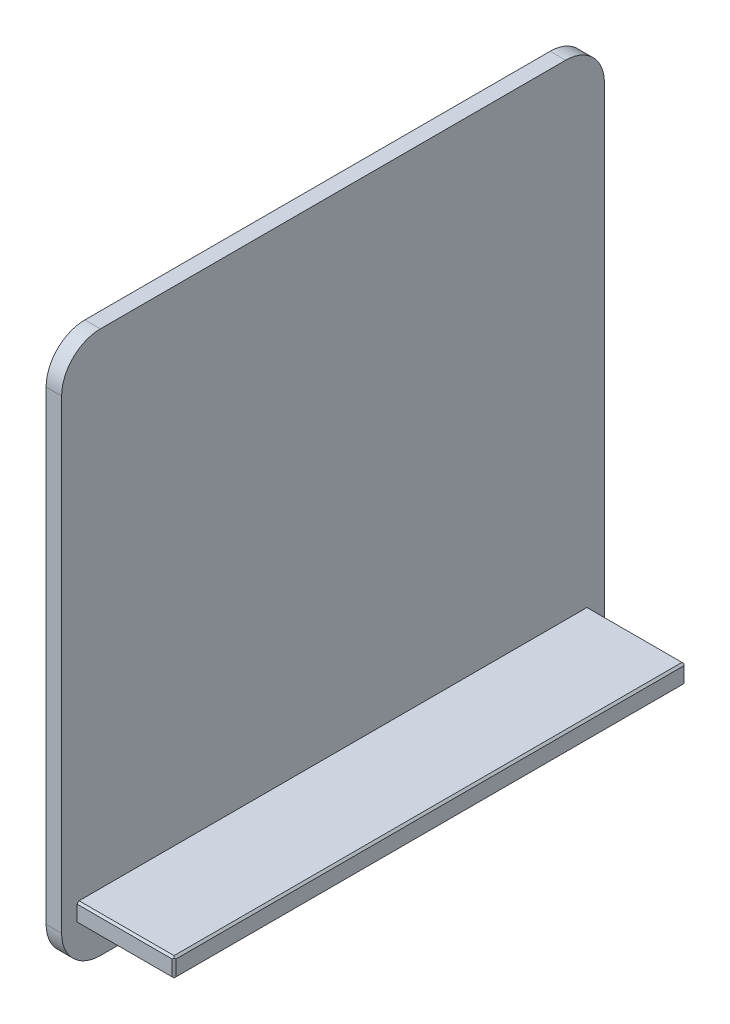
ISO-10303-21;
HEADER;
FILE_DESCRIPTION(('STEP AP214'),'2;1');
FILE_NAME('part.step','',(''),(''),'','','');
FILE_SCHEMA(('AUTOMOTIVE_DESIGN { 1 0 10303 214 1 1 1 1 }'));
ENDSEC;
DATA;
#1=APPLICATION_CONTEXT('core data for automotive mechanical design processes');
#2=APPLICATION_PROTOCOL_DEFINITION('international standard','automotive_design',2000,#1);
#3=PRODUCT_CONTEXT('',#1,'mechanical');
#4=PRODUCT('Part','Part','',(#3));
#5=PRODUCT_RELATED_PRODUCT_CATEGORY('part','',(#4));
#6=PRODUCT_DEFINITION_FORMATION('','',#4);
#7=PRODUCT_DEFINITION_CONTEXT('part definition',#1,'design');
#8=PRODUCT_DEFINITION('design','',#6,#7);
#9=PRODUCT_DEFINITION_SHAPE('','',#8);
#10=(LENGTH_UNIT() NAMED_UNIT(*) SI_UNIT(.MILLI.,.METRE.));
#11=(NAMED_UNIT(*) PLANE_ANGLE_UNIT() SI_UNIT($,.RADIAN.));
#12=(NAMED_UNIT(*) SI_UNIT($,.STERADIAN.) SOLID_ANGLE_UNIT());
#13=UNCERTAINTY_MEASURE_WITH_UNIT(LENGTH_MEASURE(1.E-05),#10,'distance_accuracy_value','');
#14=(GEOMETRIC_REPRESENTATION_CONTEXT(3) GLOBAL_UNCERTAINTY_ASSIGNED_CONTEXT((#13)) GLOBAL_UNIT_ASSIGNED_CONTEXT((#10,
#11,#12)) REPRESENTATION_CONTEXT('',''));
#15=CARTESIAN_POINT('',(0.,0.,0.));
#16=DIRECTION('',(0.,0.,1.));
#17=DIRECTION('',(1.,0.,0.));
#18=AXIS2_PLACEMENT_3D('',#15,#16,#17);
#19=CARTESIAN_POINT('',(4.,0.,0.));
#20=DIRECTION('',(1.,0.,0.));
#21=DIRECTION('',(0.,0.,-1.));
#22=AXIS2_PLACEMENT_3D('',#19,#20,#21);
#23=PLANE('',#22);
#24=DIRECTION('',(0.,0.,-1.));
#25=VECTOR('',#24,1.);
#26=CARTESIAN_POINT('',(4.,-70.,70.));
#27=LINE('',#26,#25);
#28=CARTESIAN_POINT('',(4.,-70.,60.));
#29=VERTEX_POINT('',#28);
#30=CARTESIAN_POINT('',(4.,-70.,-60.));
#31=VERTEX_POINT('',#30);
#32=EDGE_CURVE('E371',#29,#31,#27,.T.);
#33=ORIENTED_EDGE('',*,*,#32,.T.);
#34=CARTESIAN_POINT('',(4.,-60.,-60.));
#35=DIRECTION('',(1.,0.,0.));
#36=DIRECTION('',(0.,0.,-1.));
#37=AXIS2_PLACEMENT_3D('',#34,#35,#36);
#38=CIRCLE('',#37,10.);
#39=CARTESIAN_POINT('',(4.,-60.,-70.));
#40=VERTEX_POINT('',#39);
#41=EDGE_CURVE('E344',#31,#40,#38,.T.);
#42=ORIENTED_EDGE('',*,*,#41,.T.);
#43=DIRECTION('',(0.,1.,0.));
#44=VECTOR('',#43,1.);
#45=CARTESIAN_POINT('',(4.,70.,-70.));
#46=LINE('',#45,#44);
#47=CARTESIAN_POINT('',(4.,60.,-70.));
#48=VERTEX_POINT('',#47);
#49=EDGE_CURVE('E432',#40,#48,#46,.T.);
#50=ORIENTED_EDGE('',*,*,#49,.T.);
#51=CARTESIAN_POINT('',(4.,60.,-60.));
#52=DIRECTION('',(1.,0.,0.));
#53=DIRECTION('',(0.,0.,-1.));
#54=AXIS2_PLACEMENT_3D('',#51,#52,#53);
#55=CIRCLE('',#54,10.);
#56=CARTESIAN_POINT('',(4.,70.,-60.));
#57=VERTEX_POINT('',#56);
#58=EDGE_CURVE('E69',#48,#57,#55,.T.);
#59=ORIENTED_EDGE('',*,*,#58,.T.);
#60=DIRECTION('',(0.,0.,1.));
#61=VECTOR('',#60,1.);
#62=CARTESIAN_POINT('',(4.,70.,70.));
#63=LINE('',#62,#61);
#64=CARTESIAN_POINT('',(4.,70.,60.));
#65=VERTEX_POINT('',#64);
#66=EDGE_CURVE('E210',#57,#65,#63,.T.);
#67=ORIENTED_EDGE('',*,*,#66,.T.);
#68=CARTESIAN_POINT('',(4.,60.,60.));
#69=DIRECTION('',(1.,0.,0.));
#70=DIRECTION('',(0.,0.,-1.));
#71=AXIS2_PLACEMENT_3D('',#68,#69,#70);
#72=CIRCLE('',#71,10.);
#73=CARTESIAN_POINT('',(4.,60.,70.));
#74=VERTEX_POINT('',#73);
#75=EDGE_CURVE('E336',#65,#74,#72,.T.);
#76=ORIENTED_EDGE('',*,*,#75,.T.);
#77=DIRECTION('',(0.,-1.,0.));
#78=VECTOR('',#77,1.);
#79=CARTESIAN_POINT('',(4.,70.,70.));
#80=LINE('',#79,#78);
#81=CARTESIAN_POINT('',(4.,-60.,70.));
#82=VERTEX_POINT('',#81);
#83=EDGE_CURVE('E360',#74,#82,#80,.T.);
#84=ORIENTED_EDGE('',*,*,#83,.T.);
#85=CARTESIAN_POINT('',(4.,-60.,60.));
#86=DIRECTION('',(1.,0.,0.));
#87=DIRECTION('',(0.,0.,-1.));
#88=AXIS2_PLACEMENT_3D('',#85,#86,#87);
#89=CIRCLE('',#88,10.);
#90=EDGE_CURVE('E341',#82,#29,#89,.T.);
#91=ORIENTED_EDGE('',*,*,#90,.T.);
#92=EDGE_LOOP('',(#33,#42,#50,#59,#67,#76,#84,#91));
#93=FACE_BOUND('',#92,.T.);
#94=DIRECTION('',(0.,0.,-1.));
#95=VECTOR('',#94,1.);
#96=CARTESIAN_POINT('',(4.,-60.,66.));
#97=LINE('',#96,#95);
#98=CARTESIAN_POINT('',(4.,-60.,65.5));
#99=VERTEX_POINT('',#98);
#100=CARTESIAN_POINT('',(4.,-60.,-65.4999999999999));
#101=VERTEX_POINT('',#100);
#102=EDGE_CURVE('E426',#99,#101,#97,.T.);
#103=ORIENTED_EDGE('',*,*,#102,.F.);
#104=DIRECTION('',(0.,-0.707106781186548,-0.707106781186548));
#105=VECTOR('',#104,1.);
#106=CARTESIAN_POINT('',(4.,-60.,65.5));
#107=LINE('',#106,#105);
#108=CARTESIAN_POINT('',(4.,-59.5,66.));
#109=VERTEX_POINT('',#108);
#110=EDGE_CURVE('E304',#99,#109,#107,.F.);
#111=ORIENTED_EDGE('',*,*,#110,.T.);
#112=DIRECTION('',(0.,-1.,0.));
#113=VECTOR('',#112,1.);
#114=CARTESIAN_POINT('',(4.,-55.,66.));
#115=LINE('',#114,#113);
#116=CARTESIAN_POINT('',(4.,-55.5,66.));
#117=VERTEX_POINT('',#116);
#118=EDGE_CURVE('E247',#117,#109,#115,.T.);
#119=ORIENTED_EDGE('',*,*,#118,.F.);
#120=DIRECTION('',(0.,-0.707106781186548,0.707106781186548));
#121=VECTOR('',#120,1.);
#122=CARTESIAN_POINT('',(4.,-55.5,66.));
#123=LINE('',#122,#121);
#124=CARTESIAN_POINT('',(4.,-55.,65.5));
#125=VERTEX_POINT('',#124);
#126=EDGE_CURVE('E307',#117,#125,#123,.F.);
#127=ORIENTED_EDGE('',*,*,#126,.T.);
#128=DIRECTION('',(0.,0.,1.));
#129=VECTOR('',#128,1.);
#130=CARTESIAN_POINT('',(4.,-55.,66.));
#131=LINE('',#130,#129);
#132=CARTESIAN_POINT('',(4.,-55.,-65.5));
#133=VERTEX_POINT('',#132);
#134=EDGE_CURVE('E392',#133,#125,#131,.T.);
#135=ORIENTED_EDGE('',*,*,#134,.F.);
#136=DIRECTION('',(0.,0.707106781186567,0.707106781186528));
#137=VECTOR('',#136,1.);
#138=CARTESIAN_POINT('',(4.,-55.,-65.5));
#139=LINE('',#138,#137);
#140=CARTESIAN_POINT('',(4.,-55.5,-66.));
#141=VERTEX_POINT('',#140);
#142=EDGE_CURVE('E301',#133,#141,#139,.F.);
#143=ORIENTED_EDGE('',*,*,#142,.T.);
#144=DIRECTION('',(0.,1.,0.));
#145=VECTOR('',#144,1.);
#146=CARTESIAN_POINT('',(4.,-55.,-66.));
#147=LINE('',#146,#145);
#148=CARTESIAN_POINT('',(4.,-59.5,-66.));
#149=VERTEX_POINT('',#148);
#150=EDGE_CURVE('E423',#149,#141,#147,.T.);
#151=ORIENTED_EDGE('',*,*,#150,.F.);
#152=DIRECTION('',(0.,0.707106781186518,-0.707106781186577));
#153=VECTOR('',#152,1.);
#154=CARTESIAN_POINT('',(4.,-59.5,-66.));
#155=LINE('',#154,#153);
#156=EDGE_CURVE('E298',#149,#101,#155,.F.);
#157=ORIENTED_EDGE('',*,*,#156,.T.);
#158=EDGE_LOOP('',(#103,#111,#119,#127,#135,#143,#151,#157));
#159=FACE_BOUND('',#158,.T.);
#160=ADVANCED_FACE('F47',(#93,#159),#23,.T.);
#161=CARTESIAN_POINT('',(4.,70.,70.));
#162=DIRECTION('',(0.,0.,-1.));
#163=DIRECTION('',(0.,1.,0.));
#164=AXIS2_PLACEMENT_3D('',#161,#162,#163);
#165=PLANE('',#164);
#166=DIRECTION('',(0.,-1.,0.));
#167=VECTOR('',#166,1.);
#168=CARTESIAN_POINT('',(0.,70.,70.));
#169=LINE('',#168,#167);
#170=CARTESIAN_POINT('',(0.,60.,70.));
#171=VERTEX_POINT('',#170);
#172=CARTESIAN_POINT('',(0.,-60.,70.));
#173=VERTEX_POINT('',#172);
#174=EDGE_CURVE('E363',#171,#173,#169,.T.);
#175=ORIENTED_EDGE('',*,*,#174,.T.);
#176=DIRECTION('',(-1.,0.,0.));
#177=VECTOR('',#176,1.);
#178=CARTESIAN_POINT('',(4.,-60.,70.));
#179=LINE('',#178,#177);
#180=EDGE_CURVE('E351',#173,#82,#179,.F.);
#181=ORIENTED_EDGE('',*,*,#180,.T.);
#182=ORIENTED_EDGE('',*,*,#83,.F.);
#183=DIRECTION('',(-1.,0.,0.));
#184=VECTOR('',#183,1.);
#185=CARTESIAN_POINT('',(4.,60.,70.));
#186=LINE('',#185,#184);
#187=EDGE_CURVE('E347',#74,#171,#186,.T.);
#188=ORIENTED_EDGE('',*,*,#187,.T.);
#189=EDGE_LOOP('',(#175,#181,#182,#188));
#190=FACE_BOUND('',#189,.T.);
#191=ADVANCED_FACE('F359',(#190),#165,.F.);
#192=CARTESIAN_POINT('',(4.,-70.,70.));
#193=DIRECTION('',(0.,1.,0.));
#194=DIRECTION('',(0.,0.,1.));
#195=AXIS2_PLACEMENT_3D('',#192,#193,#194);
#196=PLANE('',#195);
#197=DIRECTION('',(0.,0.,-1.));
#198=VECTOR('',#197,1.);
#199=CARTESIAN_POINT('',(0.,-70.,70.));
#200=LINE('',#199,#198);
#201=CARTESIAN_POINT('',(0.,-70.,60.));
#202=VERTEX_POINT('',#201);
#203=CARTESIAN_POINT('',(0.,-70.,-60.));
#204=VERTEX_POINT('',#203);
#205=EDGE_CURVE('E380',#202,#204,#200,.T.);
#206=ORIENTED_EDGE('',*,*,#205,.T.);
#207=DIRECTION('',(-1.,0.,0.));
#208=VECTOR('',#207,1.);
#209=CARTESIAN_POINT('',(4.,-70.,-60.));
#210=LINE('',#209,#208);
#211=EDGE_CURVE('E333',#204,#31,#210,.F.);
#212=ORIENTED_EDGE('',*,*,#211,.T.);
#213=ORIENTED_EDGE('',*,*,#32,.F.);
#214=DIRECTION('',(-1.,0.,0.));
#215=VECTOR('',#214,1.);
#216=CARTESIAN_POINT('',(4.,-70.,60.));
#217=LINE('',#216,#215);
#218=EDGE_CURVE('E329',#29,#202,#217,.T.);
#219=ORIENTED_EDGE('',*,*,#218,.T.);
#220=EDGE_LOOP('',(#206,#212,#213,#219));
#221=FACE_BOUND('',#220,.T.);
#222=ADVANCED_FACE('F379',(#221),#196,.F.);
#223=CARTESIAN_POINT('',(4.,70.,-70.));
#224=DIRECTION('',(0.,0.,1.));
#225=DIRECTION('',(1.,0.,0.));
#226=AXIS2_PLACEMENT_3D('',#223,#224,#225);
#227=PLANE('',#226);
#228=ORIENTED_EDGE('',*,*,#49,.F.);
#229=DIRECTION('',(-1.,0.,0.));
#230=VECTOR('',#229,1.);
#231=CARTESIAN_POINT('',(4.,-60.,-70.));
#232=LINE('',#231,#230);
#233=CARTESIAN_POINT('',(0.,-60.,-70.));
#234=VERTEX_POINT('',#233);
#235=EDGE_CURVE('E313',#40,#234,#232,.T.);
#236=ORIENTED_EDGE('',*,*,#235,.T.);
#237=DIRECTION('',(0.,1.,0.));
#238=VECTOR('',#237,1.);
#239=CARTESIAN_POINT('',(0.,70.,-70.));
#240=LINE('',#239,#238);
#241=CARTESIAN_POINT('',(0.,60.,-70.));
#242=VERTEX_POINT('',#241);
#243=EDGE_CURVE('E386',#234,#242,#240,.T.);
#244=ORIENTED_EDGE('',*,*,#243,.T.);
#245=DIRECTION('',(-1.,0.,0.));
#246=VECTOR('',#245,1.);
#247=CARTESIAN_POINT('',(4.,60.,-70.));
#248=LINE('',#247,#246);
#249=EDGE_CURVE('E310',#242,#48,#248,.F.);
#250=ORIENTED_EDGE('',*,*,#249,.T.);
#251=EDGE_LOOP('',(#228,#236,#244,#250));
#252=FACE_BOUND('',#251,.T.);
#253=ADVANCED_FACE('F444',(#252),#227,.F.);
#254=CARTESIAN_POINT('',(4.,70.,70.));
#255=DIRECTION('',(0.,-1.,0.));
#256=DIRECTION('',(0.,0.,-1.));
#257=AXIS2_PLACEMENT_3D('',#254,#255,#256);
#258=PLANE('',#257);
#259=ORIENTED_EDGE('',*,*,#66,.F.);
#260=DIRECTION('',(-1.,0.,0.));
#261=VECTOR('',#260,1.);
#262=CARTESIAN_POINT('',(4.,70.,-60.));
#263=LINE('',#262,#261);
#264=CARTESIAN_POINT('',(0.,70.,-60.));
#265=VERTEX_POINT('',#264);
#266=EDGE_CURVE('E11',#57,#265,#263,.T.);
#267=ORIENTED_EDGE('',*,*,#266,.T.);
#268=DIRECTION('',(0.,0.,1.));
#269=VECTOR('',#268,1.);
#270=CARTESIAN_POINT('',(0.,70.,70.));
#271=LINE('',#270,#269);
#272=CARTESIAN_POINT('',(0.,70.,60.));
#273=VERTEX_POINT('',#272);
#274=EDGE_CURVE('E372',#265,#273,#271,.T.);
#275=ORIENTED_EDGE('',*,*,#274,.T.);
#276=DIRECTION('',(-1.,0.,0.));
#277=VECTOR('',#276,1.);
#278=CARTESIAN_POINT('',(4.,70.,60.));
#279=LINE('',#278,#277);
#280=EDGE_CURVE('E56',#273,#65,#279,.F.);
#281=ORIENTED_EDGE('',*,*,#280,.T.);
#282=EDGE_LOOP('',(#259,#267,#275,#281));
#283=FACE_BOUND('',#282,.T.);
#284=ADVANCED_FACE('F438',(#283),#258,.F.);
#285=CARTESIAN_POINT('',(0.,0.,0.));
#286=DIRECTION('',(1.,0.,0.));
#287=DIRECTION('',(0.,0.,-1.));
#288=AXIS2_PLACEMENT_3D('',#285,#286,#287);
#289=PLANE('',#288);
#290=ORIENTED_EDGE('',*,*,#243,.F.);
#291=CARTESIAN_POINT('',(0.,-60.,-60.));
#292=DIRECTION('',(1.,0.,0.));
#293=DIRECTION('',(0.,0.,-1.));
#294=AXIS2_PLACEMENT_3D('',#291,#292,#293);
#295=CIRCLE('',#294,10.);
#296=EDGE_CURVE('E326',#234,#204,#295,.F.);
#297=ORIENTED_EDGE('',*,*,#296,.T.);
#298=ORIENTED_EDGE('',*,*,#205,.F.);
#299=CARTESIAN_POINT('',(0.,-60.,60.));
#300=DIRECTION('',(1.,0.,0.));
#301=DIRECTION('',(0.,0.,-1.));
#302=AXIS2_PLACEMENT_3D('',#299,#300,#301);
#303=CIRCLE('',#302,10.);
#304=EDGE_CURVE('E323',#202,#173,#303,.F.);
#305=ORIENTED_EDGE('',*,*,#304,.T.);
#306=ORIENTED_EDGE('',*,*,#174,.F.);
#307=CARTESIAN_POINT('',(0.,60.,60.));
#308=DIRECTION('',(1.,0.,0.));
#309=DIRECTION('',(0.,0.,-1.));
#310=AXIS2_PLACEMENT_3D('',#307,#308,#309);
#311=CIRCLE('',#310,10.);
#312=EDGE_CURVE('E317',#171,#273,#311,.F.);
#313=ORIENTED_EDGE('',*,*,#312,.T.);
#314=ORIENTED_EDGE('',*,*,#274,.F.);
#315=CARTESIAN_POINT('',(0.,60.,-60.));
#316=DIRECTION('',(1.,0.,0.));
#317=DIRECTION('',(0.,0.,-1.));
#318=AXIS2_PLACEMENT_3D('',#315,#316,#317);
#319=CIRCLE('',#318,10.);
#320=EDGE_CURVE('E320',#265,#242,#319,.F.);
#321=ORIENTED_EDGE('',*,*,#320,.T.);
#322=EDGE_LOOP('',(#290,#297,#298,#305,#306,#313,#314,#321));
#323=FACE_BOUND('',#322,.T.);
#324=ADVANCED_FACE('F384',(#323),#289,.F.);
#325=CARTESIAN_POINT('',(29.,-55.,66.));
#326=DIRECTION('',(0.,0.,-1.));
#327=DIRECTION('',(-1.,0.,0.));
#328=AXIS2_PLACEMENT_3D('',#325,#326,#327);
#329=PLANE('',#328);
#330=ORIENTED_EDGE('',*,*,#118,.T.);
#331=DIRECTION('',(1.,0.,0.));
#332=VECTOR('',#331,1.);
#333=CARTESIAN_POINT('',(29.,-59.5,66.));
#334=LINE('',#333,#332);
#335=CARTESIAN_POINT('',(28.5,-59.5,66.));
#336=VERTEX_POINT('',#335);
#337=EDGE_CURVE('E289',#109,#336,#334,.T.);
#338=ORIENTED_EDGE('',*,*,#337,.T.);
#339=DIRECTION('',(0.,1.,0.));
#340=VECTOR('',#339,1.);
#341=CARTESIAN_POINT('',(28.5,-55.,66.));
#342=LINE('',#341,#340);
#343=CARTESIAN_POINT('',(28.5,-55.5,66.));
#344=VERTEX_POINT('',#343);
#345=EDGE_CURVE('E234',#336,#344,#342,.T.);
#346=ORIENTED_EDGE('',*,*,#345,.T.);
#347=DIRECTION('',(-1.,0.,0.));
#348=VECTOR('',#347,1.);
#349=CARTESIAN_POINT('',(29.,-55.5,66.));
#350=LINE('',#349,#348);
#351=EDGE_CURVE('E285',#344,#117,#350,.T.);
#352=ORIENTED_EDGE('',*,*,#351,.T.);
#353=EDGE_LOOP('',(#330,#338,#346,#352));
#354=FACE_BOUND('',#353,.T.);
#355=ADVANCED_FACE('F469',(#354),#329,.F.);
#356=CARTESIAN_POINT('',(29.,-60.,66.));
#357=DIRECTION('',(0.,1.,0.));
#358=DIRECTION('',(0.,0.,1.));
#359=AXIS2_PLACEMENT_3D('',#356,#357,#358);
#360=PLANE('',#359);
#361=ORIENTED_EDGE('',*,*,#102,.T.);
#362=DIRECTION('',(1.,0.,0.));
#363=VECTOR('',#362,1.);
#364=CARTESIAN_POINT('',(29.,-60.,-65.4999999999999));
#365=LINE('',#364,#363);
#366=CARTESIAN_POINT('',(28.5,-60.,-65.4999999999999));
#367=VERTEX_POINT('',#366);
#368=EDGE_CURVE('E258',#101,#367,#365,.T.);
#369=ORIENTED_EDGE('',*,*,#368,.T.);
#370=DIRECTION('',(0.,0.,1.));
#371=VECTOR('',#370,1.);
#372=CARTESIAN_POINT('',(28.5,-60.,66.));
#373=LINE('',#372,#371);
#374=CARTESIAN_POINT('',(28.5,-60.,65.5));
#375=VERTEX_POINT('',#374);
#376=EDGE_CURVE('E230',#367,#375,#373,.T.);
#377=ORIENTED_EDGE('',*,*,#376,.T.);
#378=DIRECTION('',(-1.,0.,0.));
#379=VECTOR('',#378,1.);
#380=CARTESIAN_POINT('',(29.,-60.,65.5));
#381=LINE('',#380,#379);
#382=EDGE_CURVE('E254',#375,#99,#381,.T.);
#383=ORIENTED_EDGE('',*,*,#382,.T.);
#384=EDGE_LOOP('',(#361,#369,#377,#383));
#385=FACE_BOUND('',#384,.T.);
#386=ADVANCED_FACE('F526',(#385),#360,.F.);
#387=CARTESIAN_POINT('',(29.,-55.,-66.));
#388=DIRECTION('',(0.,0.,1.));
#389=DIRECTION('',(0.,-1.,0.));
#390=AXIS2_PLACEMENT_3D('',#387,#388,#389);
#391=PLANE('',#390);
#392=DIRECTION('',(0.,-1.,0.));
#393=VECTOR('',#392,1.);
#394=CARTESIAN_POINT('',(28.5,-60.,-66.));
#395=LINE('',#394,#393);
#396=CARTESIAN_POINT('',(28.5,-55.5,-66.));
#397=VERTEX_POINT('',#396);
#398=CARTESIAN_POINT('',(28.5,-59.5,-66.));
#399=VERTEX_POINT('',#398);
#400=EDGE_CURVE('E222',#397,#399,#395,.T.);
#401=ORIENTED_EDGE('',*,*,#400,.T.);
#402=DIRECTION('',(-1.,0.,0.));
#403=VECTOR('',#402,1.);
#404=CARTESIAN_POINT('',(29.,-59.5,-66.));
#405=LINE('',#404,#403);
#406=EDGE_CURVE('E250',#399,#149,#405,.T.);
#407=ORIENTED_EDGE('',*,*,#406,.T.);
#408=ORIENTED_EDGE('',*,*,#150,.T.);
#409=DIRECTION('',(1.,0.,0.));
#410=VECTOR('',#409,1.);
#411=CARTESIAN_POINT('',(29.,-55.5,-66.));
#412=LINE('',#411,#410);
#413=EDGE_CURVE('E237',#141,#397,#412,.T.);
#414=ORIENTED_EDGE('',*,*,#413,.T.);
#415=EDGE_LOOP('',(#401,#407,#408,#414));
#416=FACE_BOUND('',#415,.T.);
#417=ADVANCED_FACE('F536',(#416),#391,.F.);
#418=CARTESIAN_POINT('',(29.,-55.,66.));
#419=DIRECTION('',(0.,-1.,0.));
#420=DIRECTION('',(0.,0.,-1.));
#421=AXIS2_PLACEMENT_3D('',#418,#419,#420);
#422=PLANE('',#421);
#423=DIRECTION('',(0.,0.,-1.));
#424=VECTOR('',#423,1.);
#425=CARTESIAN_POINT('',(28.5,-55.,-66.));
#426=LINE('',#425,#424);
#427=CARTESIAN_POINT('',(28.5,-55.,65.5));
#428=VERTEX_POINT('',#427);
#429=CARTESIAN_POINT('',(28.5,-55.,-65.5));
#430=VERTEX_POINT('',#429);
#431=EDGE_CURVE('E217',#428,#430,#426,.T.);
#432=ORIENTED_EDGE('',*,*,#431,.T.);
#433=DIRECTION('',(-1.,0.,0.));
#434=VECTOR('',#433,1.);
#435=CARTESIAN_POINT('',(29.,-55.,-65.5));
#436=LINE('',#435,#434);
#437=EDGE_CURVE('E276',#430,#133,#436,.T.);
#438=ORIENTED_EDGE('',*,*,#437,.T.);
#439=ORIENTED_EDGE('',*,*,#134,.T.);
#440=DIRECTION('',(1.,0.,0.));
#441=VECTOR('',#440,1.);
#442=CARTESIAN_POINT('',(29.,-55.,65.5));
#443=LINE('',#442,#441);
#444=EDGE_CURVE('E273',#125,#428,#443,.T.);
#445=ORIENTED_EDGE('',*,*,#444,.T.);
#446=EDGE_LOOP('',(#432,#438,#439,#445));
#447=FACE_BOUND('',#446,.T.);
#448=ADVANCED_FACE('F416',(#447),#422,.F.);
#449=CARTESIAN_POINT('',(29.,0.,0.));
#450=DIRECTION('',(1.,0.,0.));
#451=DIRECTION('',(0.,0.,-1.));
#452=AXIS2_PLACEMENT_3D('',#449,#450,#451);
#453=PLANE('',#452);
#454=DIRECTION('',(0.,1.,0.));
#455=VECTOR('',#454,1.);
#456=CARTESIAN_POINT('',(29.,-55.,-65.5));
#457=LINE('',#456,#455);
#458=CARTESIAN_POINT('',(29.,-59.5,-65.5));
#459=VERTEX_POINT('',#458);
#460=CARTESIAN_POINT('',(29.,-55.5,-65.5));
#461=VERTEX_POINT('',#460);
#462=EDGE_CURVE('E214',#459,#461,#457,.T.);
#463=ORIENTED_EDGE('',*,*,#462,.T.);
#464=DIRECTION('',(0.,0.,1.));
#465=VECTOR('',#464,1.);
#466=CARTESIAN_POINT('',(29.,-55.5,66.));
#467=LINE('',#466,#465);
#468=CARTESIAN_POINT('',(29.,-55.5,65.5));
#469=VERTEX_POINT('',#468);
#470=EDGE_CURVE('E191',#461,#469,#467,.T.);
#471=ORIENTED_EDGE('',*,*,#470,.T.);
#472=DIRECTION('',(0.,-1.,0.));
#473=VECTOR('',#472,1.);
#474=CARTESIAN_POINT('',(29.,-60.,65.5));
#475=LINE('',#474,#473);
#476=CARTESIAN_POINT('',(29.,-59.5,65.5));
#477=VERTEX_POINT('',#476);
#478=EDGE_CURVE('E201',#469,#477,#475,.T.);
#479=ORIENTED_EDGE('',*,*,#478,.T.);
#480=DIRECTION('',(0.,0.,-1.));
#481=VECTOR('',#480,1.);
#482=CARTESIAN_POINT('',(29.,-59.5,-66.));
#483=LINE('',#482,#481);
#484=EDGE_CURVE('E209',#477,#459,#483,.T.);
#485=ORIENTED_EDGE('',*,*,#484,.T.);
#486=EDGE_LOOP('',(#463,#471,#479,#485));
#487=FACE_BOUND('',#486,.T.);
#488=ADVANCED_FACE('F212',(#487),#453,.T.);
#489=CARTESIAN_POINT('',(29.,-59.5,0.));
#490=DIRECTION('',(0.707106781186547,-0.707106781186547,0.));
#491=DIRECTION('',(0.,0.,1.));
#492=AXIS2_PLACEMENT_3D('',#489,#490,#491);
#493=PLANE('',#492);
#494=ORIENTED_EDGE('',*,*,#376,.F.);
#495=DIRECTION('',(-0.57735026918961,-0.57735026918961,0.577350269189658));
#496=VECTOR('',#495,1.);
#497=CARTESIAN_POINT('',(6.9999999999994,-81.5000000000006,-43.9999999999975));
#498=LINE('',#497,#496);
#499=CARTESIAN_POINT('',(28.75,-59.75,-65.75));
#500=VERTEX_POINT('',#499);
#501=EDGE_CURVE('E264',#367,#500,#498,.F.);
#502=ORIENTED_EDGE('',*,*,#501,.T.);
#503=DIRECTION('',(0.577350269189626,0.577350269189626,0.577350269189625));
#504=VECTOR('',#503,1.);
#505=CARTESIAN_POINT('',(50.8333333333333,-37.6666666666667,-43.6666666666667));
#506=LINE('',#505,#504);
#507=EDGE_CURVE('E243',#459,#500,#506,.F.);
#508=ORIENTED_EDGE('',*,*,#507,.F.);
#509=ORIENTED_EDGE('',*,*,#484,.F.);
#510=DIRECTION('',(0.577350269189626,0.577350269189626,-0.577350269189626));
#511=VECTOR('',#510,1.);
#512=CARTESIAN_POINT('',(48.8333333333333,-39.6666666666667,45.6666666666667));
#513=LINE('',#512,#511);
#514=CARTESIAN_POINT('',(28.75,-59.75,65.75));
#515=VERTEX_POINT('',#514);
#516=EDGE_CURVE('E205',#515,#477,#513,.T.);
#517=ORIENTED_EDGE('',*,*,#516,.F.);
#518=DIRECTION('',(0.577350269189626,0.577350269189626,0.577350269189626));
#519=VECTOR('',#518,1.);
#520=CARTESIAN_POINT('',(7.,-81.5,44.));
#521=LINE('',#520,#519);
#522=EDGE_CURVE('E261',#515,#375,#521,.F.);
#523=ORIENTED_EDGE('',*,*,#522,.T.);
#524=EDGE_LOOP('',(#494,#502,#508,#509,#517,#523));
#525=FACE_BOUND('',#524,.T.);
#526=ADVANCED_FACE('F401',(#525),#493,.T.);
#527=CARTESIAN_POINT('',(29.,-1.8179902028237E-13,-65.5000000000002));
#528=DIRECTION('',(0.707106781186547,0.,-0.707106781186547));
#529=DIRECTION('',(0.,-1.,0.));
#530=AXIS2_PLACEMENT_3D('',#527,#528,#529);
#531=PLANE('',#530);
#532=ORIENTED_EDGE('',*,*,#507,.T.);
#533=DIRECTION('',(0.577350269189641,-0.577350269189594,0.577350269189642));
#534=VECTOR('',#533,1.);
#535=CARTESIAN_POINT('',(9.0000000000006,-40.0000000000022,-85.4999999999994));
#536=LINE('',#535,#534);
#537=EDGE_CURVE('E270',#500,#399,#536,.F.);
#538=ORIENTED_EDGE('',*,*,#537,.T.);
#539=ORIENTED_EDGE('',*,*,#400,.F.);
#540=DIRECTION('',(-0.577350269189616,-0.577350269189647,-0.577350269189615));
#541=VECTOR('',#540,1.);
#542=CARTESIAN_POINT('',(47.3333333333336,-36.6666666666655,-47.1666666666665));
#543=LINE('',#542,#541);
#544=CARTESIAN_POINT('',(28.75,-55.25,-65.75));
#545=VERTEX_POINT('',#544);
#546=EDGE_CURVE('E267',#397,#545,#543,.F.);
#547=ORIENTED_EDGE('',*,*,#546,.T.);
#548=DIRECTION('',(0.577350269189625,-0.577350269189625,0.577350269189627));
#549=VECTOR('',#548,1.);
#550=CARTESIAN_POINT('',(10.5,-37.,-84.));
#551=LINE('',#550,#549);
#552=EDGE_CURVE('E198',#461,#545,#551,.F.);
#553=ORIENTED_EDGE('',*,*,#552,.F.);
#554=ORIENTED_EDGE('',*,*,#462,.F.);
#555=EDGE_LOOP('',(#532,#538,#539,#547,#553,#554));
#556=FACE_BOUND('',#555,.T.);
#557=ADVANCED_FACE('F405',(#556),#531,.T.);
#558=CARTESIAN_POINT('',(29.,0.,65.5));
#559=DIRECTION('',(0.707106781186547,0.,0.707106781186547));
#560=DIRECTION('',(0.,1.,0.));
#561=AXIS2_PLACEMENT_3D('',#558,#559,#560);
#562=PLANE('',#561);
#563=ORIENTED_EDGE('',*,*,#345,.F.);
#564=DIRECTION('',(-0.577350269189626,0.577350269189626,0.577350269189626));
#565=VECTOR('',#564,1.);
#566=CARTESIAN_POINT('',(9.,-40.,85.5));
#567=LINE('',#566,#565);
#568=EDGE_CURVE('E295',#336,#515,#567,.F.);
#569=ORIENTED_EDGE('',*,*,#568,.T.);
#570=ORIENTED_EDGE('',*,*,#516,.T.);
#571=ORIENTED_EDGE('',*,*,#478,.F.);
#572=DIRECTION('',(-0.577350269189626,0.577350269189626,0.577350269189626));
#573=VECTOR('',#572,1.);
#574=CARTESIAN_POINT('',(10.5,-37.,84.));
#575=LINE('',#574,#573);
#576=CARTESIAN_POINT('',(28.75,-55.25,65.75));
#577=VERTEX_POINT('',#576);
#578=EDGE_CURVE('E186',#577,#469,#575,.F.);
#579=ORIENTED_EDGE('',*,*,#578,.F.);
#580=DIRECTION('',(0.577350269189626,0.577350269189626,-0.577350269189626));
#581=VECTOR('',#580,1.);
#582=CARTESIAN_POINT('',(47.3333333333333,-36.6666666666667,47.1666666666667));
#583=LINE('',#582,#581);
#584=EDGE_CURVE('E292',#577,#344,#583,.F.);
#585=ORIENTED_EDGE('',*,*,#584,.T.);
#586=EDGE_LOOP('',(#563,#569,#570,#571,#579,#585));
#587=FACE_BOUND('',#586,.T.);
#588=ADVANCED_FACE('F203',(#587),#562,.T.);
#589=CARTESIAN_POINT('',(29.,-55.5,0.));
#590=DIRECTION('',(0.707106781186547,0.707106781186547,0.));
#591=DIRECTION('',(0.,0.,-1.));
#592=AXIS2_PLACEMENT_3D('',#589,#590,#591);
#593=PLANE('',#592);
#594=ORIENTED_EDGE('',*,*,#552,.T.);
#595=DIRECTION('',(0.577350269189636,-0.577350269189636,-0.577350269189604));
#596=VECTOR('',#595,1.);
#597=CARTESIAN_POINT('',(7.00000000000042,-33.5000000000004,-44.0000000000016));
#598=LINE('',#597,#596);
#599=EDGE_CURVE('E282',#545,#430,#598,.F.);
#600=ORIENTED_EDGE('',*,*,#599,.T.);
#601=ORIENTED_EDGE('',*,*,#431,.F.);
#602=DIRECTION('',(-0.577350269189626,0.577350269189626,-0.577350269189626));
#603=VECTOR('',#602,1.);
#604=CARTESIAN_POINT('',(7.,-33.5,44.));
#605=LINE('',#604,#603);
#606=EDGE_CURVE('E194',#428,#577,#605,.F.);
#607=ORIENTED_EDGE('',*,*,#606,.T.);
#608=ORIENTED_EDGE('',*,*,#578,.T.);
#609=ORIENTED_EDGE('',*,*,#470,.F.);
#610=EDGE_LOOP('',(#594,#600,#601,#607,#608,#609));
#611=FACE_BOUND('',#610,.T.);
#612=ADVANCED_FACE('F189',(#611),#593,.T.);
#613=CARTESIAN_POINT('',(29.,-59.5,-66.));
#614=DIRECTION('',(0.,0.707106781186577,0.707106781186518));
#615=DIRECTION('',(-1.,0.,0.));
#616=AXIS2_PLACEMENT_3D('',#613,#614,#615);
#617=PLANE('',#616);
#618=ORIENTED_EDGE('',*,*,#501,.F.);
#619=ORIENTED_EDGE('',*,*,#368,.F.);
#620=ORIENTED_EDGE('',*,*,#156,.F.);
#621=ORIENTED_EDGE('',*,*,#406,.F.);
#622=ORIENTED_EDGE('',*,*,#537,.F.);
#623=EDGE_LOOP('',(#618,#619,#620,#621,#622));
#624=FACE_BOUND('',#623,.T.);
#625=ADVANCED_FACE('F485',(#624),#617,.F.);
#626=CARTESIAN_POINT('',(29.,-55.,-65.5));
#627=DIRECTION('',(0.,-0.707106781186528,0.707106781186567));
#628=DIRECTION('',(-1.,0.,0.));
#629=AXIS2_PLACEMENT_3D('',#626,#627,#628);
#630=PLANE('',#629);
#631=ORIENTED_EDGE('',*,*,#546,.F.);
#632=ORIENTED_EDGE('',*,*,#413,.F.);
#633=ORIENTED_EDGE('',*,*,#142,.F.);
#634=ORIENTED_EDGE('',*,*,#437,.F.);
#635=ORIENTED_EDGE('',*,*,#599,.F.);
#636=EDGE_LOOP('',(#631,#632,#633,#634,#635));
#637=FACE_BOUND('',#636,.T.);
#638=ADVANCED_FACE('F411',(#637),#630,.F.);
#639=CARTESIAN_POINT('',(29.,-60.,65.5));
#640=DIRECTION('',(0.,0.707106781186547,-0.707106781186547));
#641=DIRECTION('',(-1.,0.,0.));
#642=AXIS2_PLACEMENT_3D('',#639,#640,#641);
#643=PLANE('',#642);
#644=ORIENTED_EDGE('',*,*,#568,.F.);
#645=ORIENTED_EDGE('',*,*,#337,.F.);
#646=ORIENTED_EDGE('',*,*,#110,.F.);
#647=ORIENTED_EDGE('',*,*,#382,.F.);
#648=ORIENTED_EDGE('',*,*,#522,.F.);
#649=EDGE_LOOP('',(#644,#645,#646,#647,#648));
#650=FACE_BOUND('',#649,.T.);
#651=ADVANCED_FACE('F458',(#650),#643,.F.);
#652=CARTESIAN_POINT('',(29.,-55.5,66.));
#653=DIRECTION('',(0.,-0.707106781186547,-0.707106781186547));
#654=DIRECTION('',(-1.,0.,0.));
#655=AXIS2_PLACEMENT_3D('',#652,#653,#654);
#656=PLANE('',#655);
#657=ORIENTED_EDGE('',*,*,#606,.F.);
#658=ORIENTED_EDGE('',*,*,#444,.F.);
#659=ORIENTED_EDGE('',*,*,#126,.F.);
#660=ORIENTED_EDGE('',*,*,#351,.F.);
#661=ORIENTED_EDGE('',*,*,#584,.F.);
#662=EDGE_LOOP('',(#657,#658,#659,#660,#661));
#663=FACE_BOUND('',#662,.T.);
#664=ADVANCED_FACE('F450',(#663),#656,.F.);
#665=CARTESIAN_POINT('',(4.,-60.,-60.));
#666=DIRECTION('',(-1.,0.,0.));
#667=DIRECTION('',(0.,0.,1.));
#668=AXIS2_PLACEMENT_3D('',#665,#666,#667);
#669=CYLINDRICAL_SURFACE('',#668,10.);
#670=ORIENTED_EDGE('',*,*,#41,.F.);
#671=ORIENTED_EDGE('',*,*,#211,.F.);
#672=ORIENTED_EDGE('',*,*,#296,.F.);
#673=ORIENTED_EDGE('',*,*,#235,.F.);
#674=EDGE_LOOP('',(#670,#671,#672,#673));
#675=FACE_BOUND('',#674,.T.);
#676=ADVANCED_FACE('F448',(#675),#669,.T.);
#677=CARTESIAN_POINT('',(4.,-60.,60.));
#678=DIRECTION('',(-1.,0.,0.));
#679=DIRECTION('',(0.,0.,1.));
#680=AXIS2_PLACEMENT_3D('',#677,#678,#679);
#681=CYLINDRICAL_SURFACE('',#680,10.);
#682=ORIENTED_EDGE('',*,*,#90,.F.);
#683=ORIENTED_EDGE('',*,*,#180,.F.);
#684=ORIENTED_EDGE('',*,*,#304,.F.);
#685=ORIENTED_EDGE('',*,*,#218,.F.);
#686=EDGE_LOOP('',(#682,#683,#684,#685));
#687=FACE_BOUND('',#686,.T.);
#688=ADVANCED_FACE('F375',(#687),#681,.T.);
#689=CARTESIAN_POINT('',(4.,60.,-60.));
#690=DIRECTION('',(-1.,0.,0.));
#691=DIRECTION('',(0.,0.,1.));
#692=AXIS2_PLACEMENT_3D('',#689,#690,#691);
#693=CYLINDRICAL_SURFACE('',#692,10.);
#694=ORIENTED_EDGE('',*,*,#58,.F.);
#695=ORIENTED_EDGE('',*,*,#249,.F.);
#696=ORIENTED_EDGE('',*,*,#320,.F.);
#697=ORIENTED_EDGE('',*,*,#266,.F.);
#698=EDGE_LOOP('',(#694,#695,#696,#697));
#699=FACE_BOUND('',#698,.T.);
#700=ADVANCED_FACE('F440',(#699),#693,.T.);
#701=CARTESIAN_POINT('',(4.,60.,60.));
#702=DIRECTION('',(-1.,0.,0.));
#703=DIRECTION('',(0.,0.,1.));
#704=AXIS2_PLACEMENT_3D('',#701,#702,#703);
#705=CYLINDRICAL_SURFACE('',#704,10.);
#706=ORIENTED_EDGE('',*,*,#75,.F.);
#707=ORIENTED_EDGE('',*,*,#280,.F.);
#708=ORIENTED_EDGE('',*,*,#312,.F.);
#709=ORIENTED_EDGE('',*,*,#187,.F.);
#710=EDGE_LOOP('',(#706,#707,#708,#709));
#711=FACE_BOUND('',#710,.T.);
#712=ADVANCED_FACE('F49',(#711),#705,.T.);
#713=CLOSED_SHELL('',(#160,#191,#222,#253,#284,#324,#355,#386,#417,#448,#488,#526,#557,#588,
#612,#625,#638,#651,#664,#676,#688,#700,#712));
#714=MANIFOLD_SOLID_BREP('B2',#713);
#715=ADVANCED_BREP_SHAPE_REPRESENTATION('',(#18,#714),#14);
#716=SHAPE_DEFINITION_REPRESENTATION(#9,#715);
ENDSEC;
END-ISO-10303-21;
